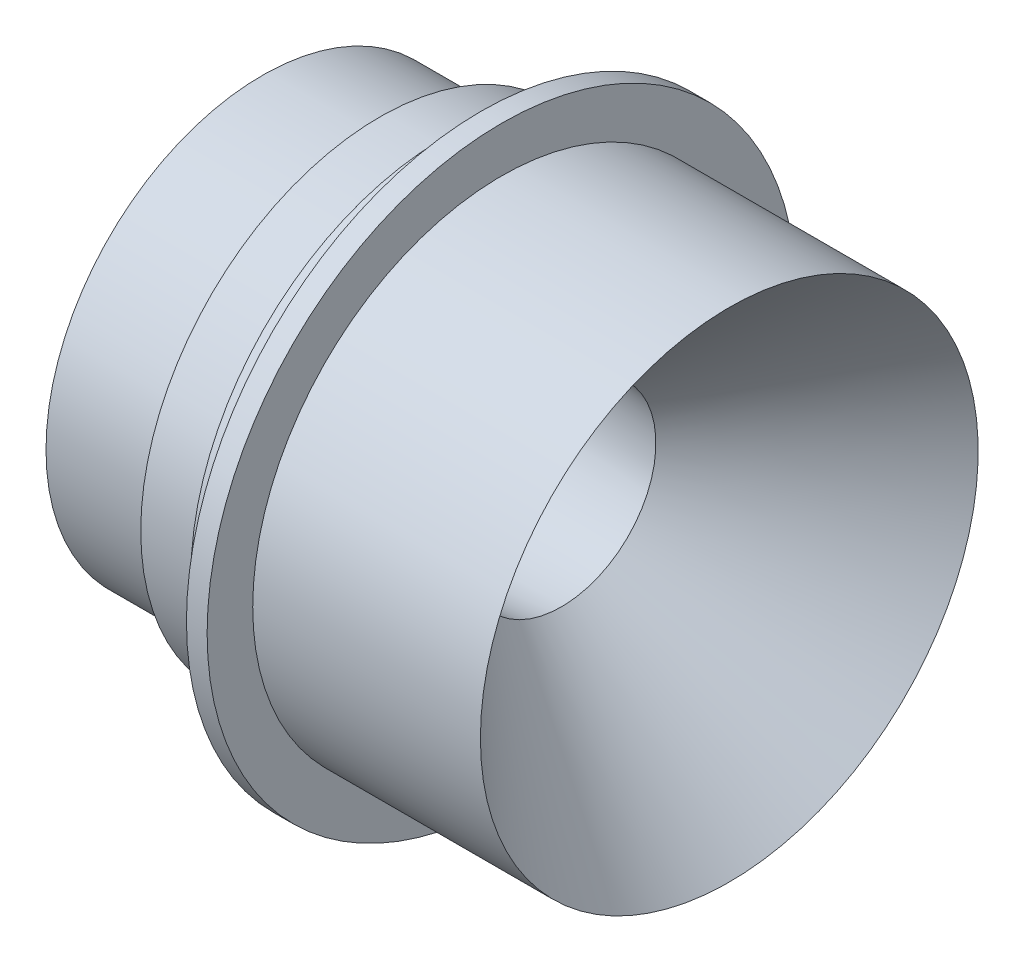
ISO-10303-21;
HEADER;
FILE_DESCRIPTION(('STEP AP214'),'2;1');
FILE_NAME('part.step','',(''),(''),'','','');
FILE_SCHEMA(('AUTOMOTIVE_DESIGN { 1 0 10303 214 1 1 1 1 }'));
ENDSEC;
DATA;
#1=APPLICATION_CONTEXT('core data for automotive mechanical design processes');
#2=APPLICATION_PROTOCOL_DEFINITION('international standard','automotive_design',2000,#1);
#3=PRODUCT_CONTEXT('',#1,'mechanical');
#4=PRODUCT('Part','Part','',(#3));
#5=PRODUCT_RELATED_PRODUCT_CATEGORY('part','',(#4));
#6=PRODUCT_DEFINITION_FORMATION('','',#4);
#7=PRODUCT_DEFINITION_CONTEXT('part definition',#1,'design');
#8=PRODUCT_DEFINITION('design','',#6,#7);
#9=PRODUCT_DEFINITION_SHAPE('','',#8);
#10=(LENGTH_UNIT() NAMED_UNIT(*) SI_UNIT(.MILLI.,.METRE.));
#11=(NAMED_UNIT(*) PLANE_ANGLE_UNIT() SI_UNIT($,.RADIAN.));
#12=(NAMED_UNIT(*) SI_UNIT($,.STERADIAN.) SOLID_ANGLE_UNIT());
#13=UNCERTAINTY_MEASURE_WITH_UNIT(LENGTH_MEASURE(1.E-05),#10,'distance_accuracy_value','');
#14=(GEOMETRIC_REPRESENTATION_CONTEXT(3) GLOBAL_UNCERTAINTY_ASSIGNED_CONTEXT((#13)) GLOBAL_UNIT_ASSIGNED_CONTEXT((#10,
#11,#12)) REPRESENTATION_CONTEXT('',''));
#15=CARTESIAN_POINT('',(0.,0.,0.));
#16=DIRECTION('',(0.,0.,1.));
#17=DIRECTION('',(1.,0.,0.));
#18=AXIS2_PLACEMENT_3D('',#15,#16,#17);
#19=CARTESIAN_POINT('',(-46.1573509933775,0.,0.));
#20=DIRECTION('',(-1.,0.,0.));
#21=DIRECTION('',(0.,0.,1.));
#22=AXIS2_PLACEMENT_3D('',#19,#20,#21);
#23=CYLINDRICAL_SURFACE('',#22,36.1315);
#24=CARTESIAN_POINT('',(-36.5499302591527,0.,0.));
#25=DIRECTION('',(-1.,0.,0.));
#26=DIRECTION('',(0.,0.,1.));
#27=AXIS2_PLACEMENT_3D('',#24,#25,#26);
#28=CIRCLE('',#27,36.1315);
#29=CARTESIAN_POINT('',(-36.5499302591527,0.,36.1315));
#30=VERTEX_POINT('',#29);
#31=EDGE_CURVE('E10',#30,#30,#28,.T.);
#32=ORIENTED_EDGE('',*,*,#31,.F.);
#33=EDGE_LOOP('',(#32));
#34=FACE_BOUND('',#33,.T.);
#35=CARTESIAN_POINT('',(-16.9001324503311,0.,0.));
#36=DIRECTION('',(-1.,0.,0.));
#37=DIRECTION('',(0.,0.,1.));
#38=AXIS2_PLACEMENT_3D('',#35,#36,#37);
#39=CIRCLE('',#38,36.1315);
#40=CARTESIAN_POINT('',(-16.9001324503311,0.,36.1315));
#41=VERTEX_POINT('',#40);
#42=EDGE_CURVE('E88',#41,#41,#39,.T.);
#43=ORIENTED_EDGE('',*,*,#42,.T.);
#44=EDGE_LOOP('',(#43));
#45=FACE_BOUND('',#44,.T.);
#46=ADVANCED_FACE('F37',(#34,#45),#23,.T.);
#47=CARTESIAN_POINT('',(-36.5499302591527,18.9713484008048,0.));
#48=DIRECTION('',(1.,0.,0.));
#49=DIRECTION('',(0.,0.,-1.));
#50=AXIS2_PLACEMENT_3D('',#47,#48,#49);
#51=PLANE('',#50);
#52=CARTESIAN_POINT('',(-36.5499302591527,0.,0.));
#53=DIRECTION('',(-1.,0.,0.));
#54=DIRECTION('',(0.,0.,1.));
#55=AXIS2_PLACEMENT_3D('',#52,#53,#54);
#56=CIRCLE('',#55,18.9713484008048);
#57=CARTESIAN_POINT('',(-36.5499302591527,0.,18.9713484008048));
#58=VERTEX_POINT('',#57);
#59=EDGE_CURVE('E44',#58,#58,#56,.T.);
#60=ORIENTED_EDGE('',*,*,#59,.F.);
#61=EDGE_LOOP('',(#60));
#62=FACE_BOUND('',#61,.T.);
#63=ORIENTED_EDGE('',*,*,#31,.T.);
#64=EDGE_LOOP('',(#63));
#65=FACE_BOUND('',#64,.T.);
#66=ADVANCED_FACE('F150',(#62,#65),#51,.F.);
#67=CARTESIAN_POINT('',(-36.5499302591527,0.,0.));
#68=DIRECTION('',(-1.,0.,0.));
#69=DIRECTION('',(0.,0.,1.));
#70=AXIS2_PLACEMENT_3D('',#67,#68,#69);
#71=CONICAL_SURFACE('',#70,18.9713484008048,0.0635845823752901);
#72=CARTESIAN_POINT('',(13.447417218543,0.,0.));
#73=DIRECTION('',(-1.,0.,0.));
#74=DIRECTION('',(0.,0.,1.));
#75=AXIS2_PLACEMENT_3D('',#72,#73,#74);
#76=CIRCLE('',#75,15.7879966887417);
#77=CARTESIAN_POINT('',(13.447417218543,0.,15.7879966887417));
#78=VERTEX_POINT('',#77);
#79=EDGE_CURVE('E49',#78,#78,#76,.T.);
#80=ORIENTED_EDGE('',*,*,#79,.F.);
#81=EDGE_LOOP('',(#80));
#82=FACE_BOUND('',#81,.T.);
#83=ORIENTED_EDGE('',*,*,#59,.T.);
#84=EDGE_LOOP('',(#83));
#85=FACE_BOUND('',#84,.T.);
#86=ADVANCED_FACE('F145',(#82,#85),#71,.F.);
#87=CARTESIAN_POINT('',(13.447417218543,0.,0.));
#88=DIRECTION('',(1.,0.,0.));
#89=DIRECTION('',(0.,0.,-1.));
#90=AXIS2_PLACEMENT_3D('',#87,#88,#89);
#91=CONICAL_SURFACE('',#90,15.7879966887417,0.743632480710274);
#92=CARTESIAN_POINT('',(41.5027210410131,0.,0.));
#93=DIRECTION('',(-1.,0.,0.));
#94=DIRECTION('',(0.,0.,1.));
#95=AXIS2_PLACEMENT_3D('',#92,#93,#94);
#96=CIRCLE('',#95,41.5925);
#97=CARTESIAN_POINT('',(41.5027210410131,0.,41.5925));
#98=VERTEX_POINT('',#97);
#99=EDGE_CURVE('E54',#98,#98,#96,.T.);
#100=ORIENTED_EDGE('',*,*,#99,.F.);
#101=EDGE_LOOP('',(#100));
#102=FACE_BOUND('',#101,.T.);
#103=ORIENTED_EDGE('',*,*,#79,.T.);
#104=EDGE_LOOP('',(#103));
#105=FACE_BOUND('',#104,.T.);
#106=ADVANCED_FACE('F139',(#102,#105),#91,.F.);
#107=CARTESIAN_POINT('',(-46.1573509933775,0.,0.));
#108=DIRECTION('',(-1.,0.,0.));
#109=DIRECTION('',(0.,0.,1.));
#110=AXIS2_PLACEMENT_3D('',#107,#108,#109);
#111=CYLINDRICAL_SURFACE('',#110,41.5925);
#112=CARTESIAN_POINT('',(3.45506974084731,0.,0.));
#113=DIRECTION('',(-1.,0.,0.));
#114=DIRECTION('',(0.,0.,1.));
#115=AXIS2_PLACEMENT_3D('',#112,#113,#114);
#116=CIRCLE('',#115,41.5925);
#117=CARTESIAN_POINT('',(3.45506974084731,0.,41.5925));
#118=VERTEX_POINT('',#117);
#119=EDGE_CURVE('E60',#118,#118,#116,.T.);
#120=ORIENTED_EDGE('',*,*,#119,.F.);
#121=EDGE_LOOP('',(#120));
#122=FACE_BOUND('',#121,.T.);
#123=ORIENTED_EDGE('',*,*,#99,.T.);
#124=EDGE_LOOP('',(#123));
#125=FACE_BOUND('',#124,.T.);
#126=ADVANCED_FACE('F133',(#122,#125),#111,.T.);
#127=CARTESIAN_POINT('',(3.45506974084731,49.2125,0.));
#128=DIRECTION('',(-1.,0.,0.));
#129=DIRECTION('',(0.,0.,1.));
#130=AXIS2_PLACEMENT_3D('',#127,#128,#129);
#131=PLANE('',#130);
#132=CARTESIAN_POINT('',(3.45506974084731,0.,0.));
#133=DIRECTION('',(-1.,0.,0.));
#134=DIRECTION('',(0.,0.,1.));
#135=AXIS2_PLACEMENT_3D('',#132,#133,#134);
#136=CIRCLE('',#135,49.2125);
#137=CARTESIAN_POINT('',(3.45506974084731,0.,49.2125));
#138=VERTEX_POINT('',#137);
#139=EDGE_CURVE('E64',#138,#138,#136,.T.);
#140=ORIENTED_EDGE('',*,*,#139,.F.);
#141=EDGE_LOOP('',(#140));
#142=FACE_BOUND('',#141,.T.);
#143=ORIENTED_EDGE('',*,*,#119,.T.);
#144=EDGE_LOOP('',(#143));
#145=FACE_BOUND('',#144,.T.);
#146=ADVANCED_FACE('F127',(#142,#145),#131,.F.);
#147=CARTESIAN_POINT('',(-46.1573509933775,0.,0.));
#148=DIRECTION('',(-1.,0.,0.));
#149=DIRECTION('',(0.,0.,1.));
#150=AXIS2_PLACEMENT_3D('',#147,#148,#149);
#151=CYLINDRICAL_SURFACE('',#150,49.2125);
#152=CARTESIAN_POINT('',(0.,0.,0.));
#153=DIRECTION('',(-1.,0.,0.));
#154=DIRECTION('',(0.,0.,1.));
#155=AXIS2_PLACEMENT_3D('',#152,#153,#154);
#156=CIRCLE('',#155,49.2125);
#157=CARTESIAN_POINT('',(0.,0.,49.2125));
#158=VERTEX_POINT('',#157);
#159=EDGE_CURVE('E68',#158,#158,#156,.T.);
#160=ORIENTED_EDGE('',*,*,#159,.F.);
#161=EDGE_LOOP('',(#160));
#162=FACE_BOUND('',#161,.T.);
#163=ORIENTED_EDGE('',*,*,#139,.T.);
#164=EDGE_LOOP('',(#163));
#165=FACE_BOUND('',#164,.T.);
#166=ADVANCED_FACE('F121',(#162,#165),#151,.T.);
#167=CARTESIAN_POINT('',(0.,42.288238410596,0.));
#168=DIRECTION('',(1.,0.,0.));
#169=DIRECTION('',(0.,0.,-1.));
#170=AXIS2_PLACEMENT_3D('',#167,#168,#169);
#171=PLANE('',#170);
#172=CARTESIAN_POINT('',(0.,0.,0.));
#173=DIRECTION('',(-1.,0.,0.));
#174=DIRECTION('',(0.,0.,1.));
#175=AXIS2_PLACEMENT_3D('',#172,#173,#174);
#176=CIRCLE('',#175,42.288238410596);
#177=CARTESIAN_POINT('',(0.,0.,42.288238410596));
#178=VERTEX_POINT('',#177);
#179=EDGE_CURVE('E72',#178,#178,#176,.T.);
#180=ORIENTED_EDGE('',*,*,#179,.F.);
#181=EDGE_LOOP('',(#180));
#182=FACE_BOUND('',#181,.T.);
#183=ORIENTED_EDGE('',*,*,#159,.T.);
#184=EDGE_LOOP('',(#183));
#185=FACE_BOUND('',#184,.T.);
#186=ADVANCED_FACE('F115',(#182,#185),#171,.F.);
#187=CARTESIAN_POINT('',(-46.1573509933775,0.,0.));
#188=DIRECTION('',(-1.,0.,0.));
#189=DIRECTION('',(0.,0.,1.));
#190=AXIS2_PLACEMENT_3D('',#187,#188,#189);
#191=CYLINDRICAL_SURFACE('',#190,42.288238410596);
#192=CARTESIAN_POINT('',(-6.17854304635763,0.,0.));
#193=DIRECTION('',(-1.,0.,0.));
#194=DIRECTION('',(0.,0.,1.));
#195=AXIS2_PLACEMENT_3D('',#192,#193,#194);
#196=CIRCLE('',#195,42.288238410596);
#197=CARTESIAN_POINT('',(-6.17854304635763,0.,42.288238410596));
#198=VERTEX_POINT('',#197);
#199=EDGE_CURVE('E76',#198,#198,#196,.T.);
#200=ORIENTED_EDGE('',*,*,#199,.F.);
#201=EDGE_LOOP('',(#200));
#202=FACE_BOUND('',#201,.T.);
#203=ORIENTED_EDGE('',*,*,#179,.T.);
#204=EDGE_LOOP('',(#203));
#205=FACE_BOUND('',#204,.T.);
#206=ADVANCED_FACE('F109',(#202,#205),#191,.T.);
#207=CARTESIAN_POINT('',(-6.17854304635763,39.9476589403973,0.));
#208=DIRECTION('',(1.,0.,0.));
#209=DIRECTION('',(0.,0.,-1.));
#210=AXIS2_PLACEMENT_3D('',#207,#208,#209);
#211=PLANE('',#210);
#212=CARTESIAN_POINT('',(-6.17854304635763,0.,0.));
#213=DIRECTION('',(-1.,0.,0.));
#214=DIRECTION('',(0.,0.,1.));
#215=AXIS2_PLACEMENT_3D('',#212,#213,#214);
#216=CIRCLE('',#215,39.9476589403973);
#217=CARTESIAN_POINT('',(-6.17854304635763,0.,39.9476589403973));
#218=VERTEX_POINT('',#217);
#219=EDGE_CURVE('E80',#218,#218,#216,.T.);
#220=ORIENTED_EDGE('',*,*,#219,.F.);
#221=EDGE_LOOP('',(#220));
#222=FACE_BOUND('',#221,.T.);
#223=ORIENTED_EDGE('',*,*,#199,.T.);
#224=EDGE_LOOP('',(#223));
#225=FACE_BOUND('',#224,.T.);
#226=ADVANCED_FACE('F103',(#222,#225),#211,.F.);
#227=CARTESIAN_POINT('',(-46.1573509933775,0.,0.));
#228=DIRECTION('',(-1.,0.,0.));
#229=DIRECTION('',(0.,0.,1.));
#230=AXIS2_PLACEMENT_3D('',#227,#228,#229);
#231=CYLINDRICAL_SURFACE('',#230,39.9476589403973);
#232=CARTESIAN_POINT('',(-16.9001324503311,0.,0.));
#233=DIRECTION('',(-1.,0.,0.));
#234=DIRECTION('',(0.,0.,1.));
#235=AXIS2_PLACEMENT_3D('',#232,#233,#234);
#236=CIRCLE('',#235,39.9476589403973);
#237=CARTESIAN_POINT('',(-16.9001324503311,0.,39.9476589403973));
#238=VERTEX_POINT('',#237);
#239=EDGE_CURVE('E84',#238,#238,#236,.T.);
#240=ORIENTED_EDGE('',*,*,#239,.F.);
#241=EDGE_LOOP('',(#240));
#242=FACE_BOUND('',#241,.T.);
#243=ORIENTED_EDGE('',*,*,#219,.T.);
#244=EDGE_LOOP('',(#243));
#245=FACE_BOUND('',#244,.T.);
#246=ADVANCED_FACE('F97',(#242,#245),#231,.T.);
#247=CARTESIAN_POINT('',(-16.9001324503311,36.1315,0.));
#248=DIRECTION('',(1.,0.,0.));
#249=DIRECTION('',(0.,0.,-1.));
#250=AXIS2_PLACEMENT_3D('',#247,#248,#249);
#251=PLANE('',#250);
#252=ORIENTED_EDGE('',*,*,#42,.F.);
#253=EDGE_LOOP('',(#252));
#254=FACE_BOUND('',#253,.T.);
#255=ORIENTED_EDGE('',*,*,#239,.T.);
#256=EDGE_LOOP('',(#255));
#257=FACE_BOUND('',#256,.T.);
#258=ADVANCED_FACE('F94',(#254,#257),#251,.F.);
#259=CLOSED_SHELL('',(#46,#66,#86,#106,#126,#146,#166,#186,#206,#226,#246,#258));
#260=MANIFOLD_SOLID_BREP('B2',#259);
#261=ADVANCED_BREP_SHAPE_REPRESENTATION('',(#18,#260),#14);
#262=SHAPE_DEFINITION_REPRESENTATION(#9,#261);
ENDSEC;
END-ISO-10303-21;
